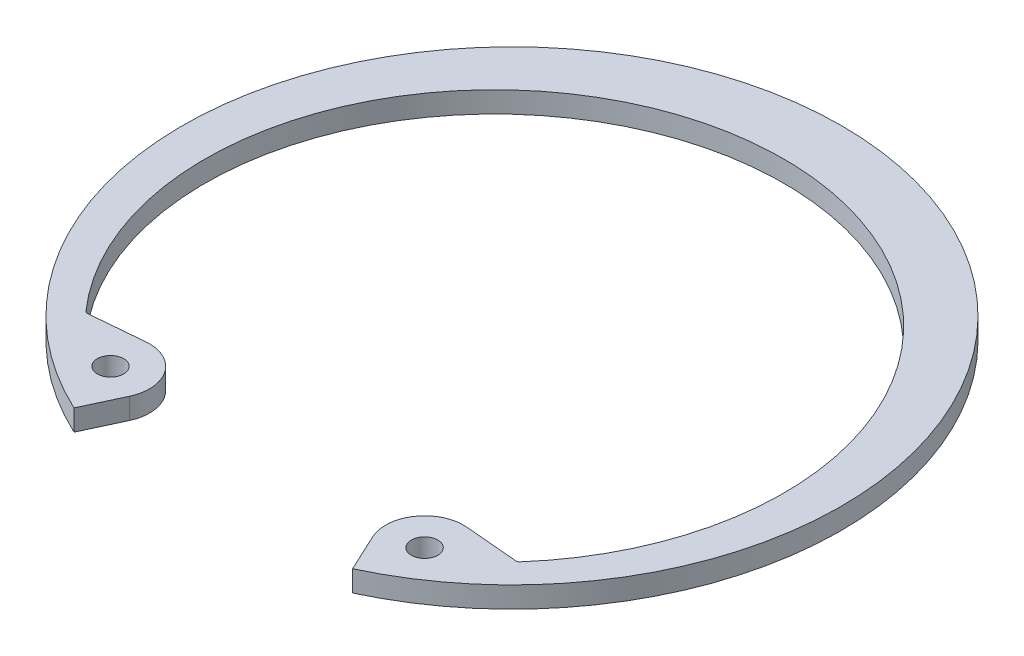
ISO-10303-21;
HEADER;
FILE_DESCRIPTION(('STEP AP214'),'2;1');
FILE_NAME('part.step','',(''),(''),'','','');
FILE_SCHEMA(('AUTOMOTIVE_DESIGN { 1 0 10303 214 1 1 1 1 }'));
ENDSEC;
DATA;
#1=APPLICATION_CONTEXT('core data for automotive mechanical design processes');
#2=APPLICATION_PROTOCOL_DEFINITION('international standard','automotive_design',2000,#1);
#3=PRODUCT_CONTEXT('',#1,'mechanical');
#4=PRODUCT('Part','Part','',(#3));
#5=PRODUCT_RELATED_PRODUCT_CATEGORY('part','',(#4));
#6=PRODUCT_DEFINITION_FORMATION('','',#4);
#7=PRODUCT_DEFINITION_CONTEXT('part definition',#1,'design');
#8=PRODUCT_DEFINITION('design','',#6,#7);
#9=PRODUCT_DEFINITION_SHAPE('','',#8);
#10=(LENGTH_UNIT() NAMED_UNIT(*) SI_UNIT(.MILLI.,.METRE.));
#11=(NAMED_UNIT(*) PLANE_ANGLE_UNIT() SI_UNIT($,.RADIAN.));
#12=(NAMED_UNIT(*) SI_UNIT($,.STERADIAN.) SOLID_ANGLE_UNIT());
#13=UNCERTAINTY_MEASURE_WITH_UNIT(LENGTH_MEASURE(1.E-05),#10,'distance_accuracy_value','');
#14=(GEOMETRIC_REPRESENTATION_CONTEXT(3) GLOBAL_UNCERTAINTY_ASSIGNED_CONTEXT((#13)) GLOBAL_UNIT_ASSIGNED_CONTEXT((#10,
#11,#12)) REPRESENTATION_CONTEXT('',''));
#15=CARTESIAN_POINT('',(0.,0.,0.));
#16=DIRECTION('',(0.,0.,1.));
#17=DIRECTION('',(1.,0.,0.));
#18=AXIS2_PLACEMENT_3D('',#15,#16,#17);
#19=CARTESIAN_POINT('',(11.7527599725772,-1.5748,18.2922002718915));
#20=DIRECTION('',(0.,1.,0.));
#21=DIRECTION('',(0.,0.,1.));
#22=AXIS2_PLACEMENT_3D('',#19,#20,#21);
#23=CYLINDRICAL_SURFACE('',#22,2.921);
#24=CARTESIAN_POINT('',(11.7527599725772,0.,18.2922002718915));
#25=DIRECTION('',(0.,1.,0.));
#26=DIRECTION('',(0.,0.,-1.));
#27=AXIS2_PLACEMENT_3D('',#24,#25,#26);
#28=CIRCLE('',#27,2.921);
#29=CARTESIAN_POINT('',(12.0073418971432,0.,15.3823155587655));
#30=VERTEX_POINT('',#29);
#31=CARTESIAN_POINT('',(9.10543492664317,0.,19.526668214436));
#32=VERTEX_POINT('',#31);
#33=EDGE_CURVE('E156',#30,#32,#28,.T.);
#34=ORIENTED_EDGE('',*,*,#33,.F.);
#35=DIRECTION('',(0.,1.,0.));
#36=VECTOR('',#35,1.);
#37=CARTESIAN_POINT('',(12.0073418971432,-1.5748,15.3823155587655));
#38=LINE('',#37,#36);
#39=CARTESIAN_POINT('',(12.0073418971432,-1.5748,15.3823155587655));
#40=VERTEX_POINT('',#39);
#41=EDGE_CURVE('E133',#40,#30,#38,.T.);
#42=ORIENTED_EDGE('',*,*,#41,.F.);
#43=CARTESIAN_POINT('',(11.7527599725772,-1.5748,18.2922002718915));
#44=DIRECTION('',(0.,1.,0.));
#45=DIRECTION('',(0.,0.,-1.));
#46=AXIS2_PLACEMENT_3D('',#43,#44,#45);
#47=CIRCLE('',#46,2.921);
#48=CARTESIAN_POINT('',(9.10543492664317,-1.5748,19.526668214436));
#49=VERTEX_POINT('',#48);
#50=EDGE_CURVE('E126',#40,#49,#47,.T.);
#51=ORIENTED_EDGE('',*,*,#50,.T.);
#52=DIRECTION('',(0.,1.,0.));
#53=VECTOR('',#52,1.);
#54=CARTESIAN_POINT('',(9.10543492664317,-1.5748,19.526668214436));
#55=LINE('',#54,#53);
#56=EDGE_CURVE('E109',#49,#32,#55,.T.);
#57=ORIENTED_EDGE('',*,*,#56,.T.);
#58=EDGE_LOOP('',(#34,#42,#51,#57));
#59=FACE_BOUND('',#58,.T.);
#60=ADVANCED_FACE('F34',(#59),#23,.T.);
#61=CARTESIAN_POINT('',(16.1504951389862,-1.5748,15.7447944986775));
#62=DIRECTION('',(0.0871557427476618,0.,-0.996194698091745));
#63=DIRECTION('',(-0.996194698091745,0.,-0.0871557427476618));
#64=AXIS2_PLACEMENT_3D('',#61,#62,#63);
#65=PLANE('',#64);
#66=DIRECTION('',(-0.996194698091745,0.,-0.0871557427476618));
#67=VECTOR('',#66,1.);
#68=CARTESIAN_POINT('',(16.1504951389862,0.,15.7447944986775));
#69=LINE('',#68,#67);
#70=CARTESIAN_POINT('',(16.0232690721609,0.,15.7336636601252));
#71=VERTEX_POINT('',#70);
#72=EDGE_CURVE('E134',#71,#30,#69,.T.);
#73=ORIENTED_EDGE('',*,*,#72,.F.);
#74=DIRECTION('',(0.,-1.,0.));
#75=VECTOR('',#74,1.);
#76=CARTESIAN_POINT('',(16.0232690721609,-1.5748,15.7336636601252));
#77=LINE('',#76,#75);
#78=CARTESIAN_POINT('',(16.0232690721609,-1.5748,15.7336636601252));
#79=VERTEX_POINT('',#78);
#80=EDGE_CURVE('E49',#71,#79,#77,.T.);
#81=ORIENTED_EDGE('',*,*,#80,.T.);
#82=DIRECTION('',(-0.996194698091745,0.,-0.0871557427476618));
#83=VECTOR('',#82,1.);
#84=CARTESIAN_POINT('',(16.1504951389862,-1.5748,15.7447944986775));
#85=LINE('',#84,#83);
#86=EDGE_CURVE('E120',#79,#40,#85,.T.);
#87=ORIENTED_EDGE('',*,*,#86,.T.);
#88=ORIENTED_EDGE('',*,*,#41,.T.);
#89=EDGE_LOOP('',(#73,#81,#87,#88));
#90=FACE_BOUND('',#89,.T.);
#91=ADVANCED_FACE('F211',(#90),#65,.T.);
#92=CARTESIAN_POINT('',(0.,-1.5748,1.3134003182426));
#93=DIRECTION('',(0.,1.,0.));
#94=DIRECTION('',(0.,0.,1.));
#95=AXIS2_PLACEMENT_3D('',#92,#93,#94);
#96=CYLINDRICAL_SURFACE('',#95,21.6588003182426);
#97=CARTESIAN_POINT('',(0.,0.,1.3134003182426));
#98=DIRECTION('',(0.,-1.,0.));
#99=DIRECTION('',(0.,0.,1.));
#100=AXIS2_PLACEMENT_3D('',#97,#98,#99);
#101=CIRCLE('',#100,21.6588003182426);
#102=CARTESIAN_POINT('',(-16.2358094013952,0.,15.6487455986003));
#103=VERTEX_POINT('',#102);
#104=CARTESIAN_POINT('',(16.2358094013952,0.,15.6487455986003));
#105=VERTEX_POINT('',#104);
#106=EDGE_CURVE('E136',#103,#105,#101,.T.);
#107=ORIENTED_EDGE('',*,*,#106,.F.);
#108=DIRECTION('',(0.,1.,0.));
#109=VECTOR('',#108,1.);
#110=CARTESIAN_POINT('',(-16.2358094013952,-1.5748,15.6487455986003));
#111=LINE('',#110,#109);
#112=CARTESIAN_POINT('',(-16.2358094013952,-1.5748,15.6487455986003));
#113=VERTEX_POINT('',#112);
#114=EDGE_CURVE('E187',#103,#113,#111,.F.);
#115=ORIENTED_EDGE('',*,*,#114,.T.);
#116=CARTESIAN_POINT('',(0.,-1.5748,1.3134003182426));
#117=DIRECTION('',(0.,-1.,0.));
#118=DIRECTION('',(0.,0.,1.));
#119=AXIS2_PLACEMENT_3D('',#116,#117,#118);
#120=CIRCLE('',#119,21.6588003182426);
#121=CARTESIAN_POINT('',(16.2358094013952,-1.5748,15.6487455986003));
#122=VERTEX_POINT('',#121);
#123=EDGE_CURVE('E152',#113,#122,#120,.T.);
#124=ORIENTED_EDGE('',*,*,#123,.T.);
#125=DIRECTION('',(0.,1.,0.));
#126=VECTOR('',#125,1.);
#127=CARTESIAN_POINT('',(16.2358094013952,-1.5748,15.6487455986003));
#128=LINE('',#127,#126);
#129=EDGE_CURVE('E184',#122,#105,#128,.T.);
#130=ORIENTED_EDGE('',*,*,#129,.T.);
#131=EDGE_LOOP('',(#107,#115,#124,#130));
#132=FACE_BOUND('',#131,.T.);
#133=ADVANCED_FACE('F207',(#132),#96,.F.);
#134=CARTESIAN_POINT('',(-16.1504951389862,-1.5748,15.7447944986774));
#135=DIRECTION('',(-0.087155742747656,0.,-0.996194698091746));
#136=DIRECTION('',(-0.996194698091746,0.,0.087155742747656));
#137=AXIS2_PLACEMENT_3D('',#134,#135,#136);
#138=PLANE('',#137);
#139=DIRECTION('',(-0.996194698091746,0.,0.087155742747656));
#140=VECTOR('',#139,1.);
#141=CARTESIAN_POINT('',(-16.1504951389862,-1.5748,15.7447944986774));
#142=LINE('',#141,#140);
#143=CARTESIAN_POINT('',(-12.0073418971431,-1.5748,15.3823155587655));
#144=VERTEX_POINT('',#143);
#145=CARTESIAN_POINT('',(-16.0232690721609,-1.5748,15.7336636601252));
#146=VERTEX_POINT('',#145);
#147=EDGE_CURVE('E149',#144,#146,#142,.T.);
#148=ORIENTED_EDGE('',*,*,#147,.T.);
#149=DIRECTION('',(0.,-1.,0.));
#150=VECTOR('',#149,1.);
#151=CARTESIAN_POINT('',(-16.0232690721609,0.,15.7336636601252));
#152=LINE('',#151,#150);
#153=CARTESIAN_POINT('',(-16.0232690721609,0.,15.7336636601252));
#154=VERTEX_POINT('',#153);
#155=EDGE_CURVE('E174',#146,#154,#152,.F.);
#156=ORIENTED_EDGE('',*,*,#155,.T.);
#157=DIRECTION('',(-0.996194698091746,0.,0.087155742747656));
#158=VECTOR('',#157,1.);
#159=CARTESIAN_POINT('',(-16.1504951389862,0.,15.7447944986774));
#160=LINE('',#159,#158);
#161=CARTESIAN_POINT('',(-12.0073418971431,0.,15.3823155587655));
#162=VERTEX_POINT('',#161);
#163=EDGE_CURVE('E169',#162,#154,#160,.T.);
#164=ORIENTED_EDGE('',*,*,#163,.F.);
#165=DIRECTION('',(0.,1.,0.));
#166=VECTOR('',#165,1.);
#167=CARTESIAN_POINT('',(-12.0073418971431,-1.5748,15.3823155587655));
#168=LINE('',#167,#166);
#169=EDGE_CURVE('E175',#144,#162,#168,.T.);
#170=ORIENTED_EDGE('',*,*,#169,.F.);
#171=EDGE_LOOP('',(#148,#156,#164,#170));
#172=FACE_BOUND('',#171,.T.);
#173=ADVANCED_FACE('F201',(#172),#138,.T.);
#174=CARTESIAN_POINT('',(-11.7527599725772,-1.5748,18.2922002718915));
#175=DIRECTION('',(0.,1.,0.));
#176=DIRECTION('',(0.,0.,1.));
#177=AXIS2_PLACEMENT_3D('',#174,#175,#176);
#178=CYLINDRICAL_SURFACE('',#177,2.921);
#179=CARTESIAN_POINT('',(-11.7527599725772,0.,18.2922002718915));
#180=DIRECTION('',(0.,1.,0.));
#181=DIRECTION('',(0.,0.,1.));
#182=AXIS2_PLACEMENT_3D('',#179,#180,#181);
#183=CIRCLE('',#182,2.921);
#184=CARTESIAN_POINT('',(-9.10543492664317,0.,19.526668214436));
#185=VERTEX_POINT('',#184);
#186=EDGE_CURVE('E166',#185,#162,#183,.T.);
#187=ORIENTED_EDGE('',*,*,#186,.F.);
#188=DIRECTION('',(0.,1.,0.));
#189=VECTOR('',#188,1.);
#190=CARTESIAN_POINT('',(-9.10543492664317,-1.5748,19.526668214436));
#191=LINE('',#190,#189);
#192=CARTESIAN_POINT('',(-9.10543492664317,-1.5748,19.526668214436));
#193=VERTEX_POINT('',#192);
#194=EDGE_CURVE('E177',#193,#185,#191,.T.);
#195=ORIENTED_EDGE('',*,*,#194,.F.);
#196=CARTESIAN_POINT('',(-11.7527599725772,-1.5748,18.2922002718915));
#197=DIRECTION('',(0.,1.,0.));
#198=DIRECTION('',(0.,0.,1.));
#199=AXIS2_PLACEMENT_3D('',#196,#197,#198);
#200=CIRCLE('',#199,2.921);
#201=EDGE_CURVE('E146',#193,#144,#200,.T.);
#202=ORIENTED_EDGE('',*,*,#201,.T.);
#203=ORIENTED_EDGE('',*,*,#169,.T.);
#204=EDGE_LOOP('',(#187,#195,#202,#203));
#205=FACE_BOUND('',#204,.T.);
#206=ADVANCED_FACE('F220',(#205),#178,.T.);
#207=CARTESIAN_POINT('',(-10.4232032366154,-1.5748,22.3526314747998));
#208=DIRECTION('',(0.906307787036653,0.,0.422618261740694));
#209=DIRECTION('',(0.422618261740694,0.,-0.906307787036653));
#210=AXIS2_PLACEMENT_3D('',#207,#208,#209);
#211=PLANE('',#210);
#212=DIRECTION('',(0.422618261740694,0.,-0.906307787036653));
#213=VECTOR('',#212,1.);
#214=CARTESIAN_POINT('',(-10.4232032366154,0.,22.3526314747998));
#215=LINE('',#214,#213);
#216=CARTESIAN_POINT('',(-10.4232032366154,0.,22.3526314747998));
#217=VERTEX_POINT('',#216);
#218=EDGE_CURVE('E163',#217,#185,#215,.T.);
#219=ORIENTED_EDGE('',*,*,#218,.F.);
#220=DIRECTION('',(0.,1.,0.));
#221=VECTOR('',#220,1.);
#222=CARTESIAN_POINT('',(-10.4232032366154,-1.5748,22.3526314747998));
#223=LINE('',#222,#221);
#224=CARTESIAN_POINT('',(-10.4232032366154,-1.5748,22.3526314747998));
#225=VERTEX_POINT('',#224);
#226=EDGE_CURVE('E179',#225,#217,#223,.T.);
#227=ORIENTED_EDGE('',*,*,#226,.F.);
#228=DIRECTION('',(0.422618261740694,0.,-0.906307787036653));
#229=VECTOR('',#228,1.);
#230=CARTESIAN_POINT('',(-10.4232032366154,-1.5748,22.3526314747998));
#231=LINE('',#230,#229);
#232=EDGE_CURVE('E143',#225,#193,#231,.T.);
#233=ORIENTED_EDGE('',*,*,#232,.T.);
#234=ORIENTED_EDGE('',*,*,#194,.T.);
#235=EDGE_LOOP('',(#219,#227,#233,#234));
#236=FACE_BOUND('',#235,.T.);
#237=ADVANCED_FACE('F217',(#236),#211,.T.);
#238=CARTESIAN_POINT('',(0.,-1.5748,0.));
#239=DIRECTION('',(0.,1.,0.));
#240=DIRECTION('',(0.,0.,1.));
#241=AXIS2_PLACEMENT_3D('',#238,#239,#240);
#242=CYLINDRICAL_SURFACE('',#241,24.6634);
#243=CARTESIAN_POINT('',(0.,0.,0.));
#244=DIRECTION('',(0.,1.,0.));
#245=DIRECTION('',(0.,0.,1.));
#246=AXIS2_PLACEMENT_3D('',#243,#244,#245);
#247=CIRCLE('',#246,24.6634);
#248=CARTESIAN_POINT('',(10.4232032366154,0.,22.3526314747998));
#249=VERTEX_POINT('',#248);
#250=EDGE_CURVE('E160',#249,#217,#247,.T.);
#251=ORIENTED_EDGE('',*,*,#250,.F.);
#252=DIRECTION('',(0.,1.,0.));
#253=VECTOR('',#252,1.);
#254=CARTESIAN_POINT('',(10.4232032366154,-1.5748,22.3526314747998));
#255=LINE('',#254,#253);
#256=CARTESIAN_POINT('',(10.4232032366154,-1.5748,22.3526314747998));
#257=VERTEX_POINT('',#256);
#258=EDGE_CURVE('E119',#257,#249,#255,.T.);
#259=ORIENTED_EDGE('',*,*,#258,.F.);
#260=CARTESIAN_POINT('',(0.,-1.5748,0.));
#261=DIRECTION('',(0.,1.,0.));
#262=DIRECTION('',(0.,0.,1.));
#263=AXIS2_PLACEMENT_3D('',#260,#261,#262);
#264=CIRCLE('',#263,24.6634);
#265=EDGE_CURVE('E129',#257,#225,#264,.T.);
#266=ORIENTED_EDGE('',*,*,#265,.T.);
#267=ORIENTED_EDGE('',*,*,#226,.T.);
#268=EDGE_LOOP('',(#251,#259,#266,#267));
#269=FACE_BOUND('',#268,.T.);
#270=ADVANCED_FACE('F215',(#269),#242,.T.);
#271=CARTESIAN_POINT('',(10.4232032366154,-1.5748,22.3526314747998));
#272=DIRECTION('',(-0.906307787036653,0.,0.422618261740694));
#273=DIRECTION('',(0.422618261740694,0.,0.906307787036653));
#274=AXIS2_PLACEMENT_3D('',#271,#272,#273);
#275=PLANE('',#274);
#276=DIRECTION('',(0.422618261740694,0.,0.906307787036653));
#277=VECTOR('',#276,1.);
#278=CARTESIAN_POINT('',(10.4232032366154,0.,22.3526314747998));
#279=LINE('',#278,#277);
#280=EDGE_CURVE('E114',#32,#249,#279,.T.);
#281=ORIENTED_EDGE('',*,*,#280,.F.);
#282=ORIENTED_EDGE('',*,*,#56,.F.);
#283=DIRECTION('',(0.422618261740694,0.,0.906307787036653));
#284=VECTOR('',#283,1.);
#285=CARTESIAN_POINT('',(10.4232032366154,-1.5748,22.3526314747998));
#286=LINE('',#285,#284);
#287=EDGE_CURVE('E112',#49,#257,#286,.T.);
#288=ORIENTED_EDGE('',*,*,#287,.T.);
#289=ORIENTED_EDGE('',*,*,#258,.T.);
#290=EDGE_LOOP('',(#281,#282,#288,#289));
#291=FACE_BOUND('',#290,.T.);
#292=ADVANCED_FACE('F111',(#291),#275,.T.);
#293=CARTESIAN_POINT('',(11.7527599725772,-1.5748,18.2922002718915));
#294=DIRECTION('',(0.,-1.,0.));
#295=DIRECTION('',(0.,0.,-1.));
#296=AXIS2_PLACEMENT_3D('',#293,#294,#295);
#297=PLANE('',#296);
#298=CARTESIAN_POINT('',(-11.7527599725772,-1.5748,18.2922002718915));
#299=DIRECTION('',(0.,1.,0.));
#300=DIRECTION('',(0.,0.,1.));
#301=AXIS2_PLACEMENT_3D('',#298,#299,#300);
#302=CIRCLE('',#301,0.990599999999999);
#303=CARTESIAN_POINT('',(-11.7527599725772,-1.5748,19.2828002718915));
#304=VERTEX_POINT('',#303);
#305=EDGE_CURVE('E361',#304,#304,#302,.T.);
#306=ORIENTED_EDGE('',*,*,#305,.T.);
#307=EDGE_LOOP('',(#306));
#308=FACE_BOUND('',#307,.T.);
#309=CARTESIAN_POINT('',(11.7527599725772,-1.5748,18.2922002718915));
#310=DIRECTION('',(0.,1.,0.));
#311=DIRECTION('',(0.,0.,1.));
#312=AXIS2_PLACEMENT_3D('',#309,#310,#311);
#313=CIRCLE('',#312,0.990599999999999);
#314=CARTESIAN_POINT('',(11.7527599725772,-1.5748,19.2828002718915));
#315=VERTEX_POINT('',#314);
#316=EDGE_CURVE('E158',#315,#315,#313,.T.);
#317=ORIENTED_EDGE('',*,*,#316,.T.);
#318=EDGE_LOOP('',(#317));
#319=FACE_BOUND('',#318,.T.);
#320=ORIENTED_EDGE('',*,*,#50,.F.);
#321=ORIENTED_EDGE('',*,*,#86,.F.);
#322=CARTESIAN_POINT('',(16.0454066308188,-1.5748,15.4806302068099));
#323=DIRECTION('',(0.,-1.,0.));
#324=DIRECTION('',(0.,0.,-1.));
#325=AXIS2_PLACEMENT_3D('',#322,#323,#324);
#326=CIRCLE('',#325,0.254);
#327=EDGE_CURVE('E11',#79,#122,#326,.F.);
#328=ORIENTED_EDGE('',*,*,#327,.T.);
#329=ORIENTED_EDGE('',*,*,#123,.F.);
#330=CARTESIAN_POINT('',(-16.0454066308188,-1.5748,15.4806302068099));
#331=DIRECTION('',(0.,-1.,0.));
#332=DIRECTION('',(0.,0.,-1.));
#333=AXIS2_PLACEMENT_3D('',#330,#331,#332);
#334=CIRCLE('',#333,0.254);
#335=EDGE_CURVE('E192',#113,#146,#334,.F.);
#336=ORIENTED_EDGE('',*,*,#335,.T.);
#337=ORIENTED_EDGE('',*,*,#147,.F.);
#338=ORIENTED_EDGE('',*,*,#201,.F.);
#339=ORIENTED_EDGE('',*,*,#232,.F.);
#340=ORIENTED_EDGE('',*,*,#265,.F.);
#341=ORIENTED_EDGE('',*,*,#287,.F.);
#342=EDGE_LOOP('',(#320,#321,#328,#329,#336,#337,#338,#339,#340,#341));
#343=FACE_BOUND('',#342,.T.);
#344=ADVANCED_FACE('F125',(#308,#319,#343),#297,.T.);
#345=CARTESIAN_POINT('',(11.7527599725772,0.,18.2922002718915));
#346=DIRECTION('',(0.,-1.,0.));
#347=DIRECTION('',(0.,0.,-1.));
#348=AXIS2_PLACEMENT_3D('',#345,#346,#347);
#349=PLANE('',#348);
#350=CARTESIAN_POINT('',(-11.7527599725772,0.,18.2922002718915));
#351=DIRECTION('',(0.,1.,0.));
#352=DIRECTION('',(0.,0.,1.));
#353=AXIS2_PLACEMENT_3D('',#350,#351,#352);
#354=CIRCLE('',#353,0.990599999999999);
#355=CARTESIAN_POINT('',(-11.7527599725772,0.,19.2828002718915));
#356=VERTEX_POINT('',#355);
#357=EDGE_CURVE('E357',#356,#356,#354,.T.);
#358=ORIENTED_EDGE('',*,*,#357,.F.);
#359=EDGE_LOOP('',(#358));
#360=FACE_BOUND('',#359,.T.);
#361=CARTESIAN_POINT('',(11.7527599725772,0.,18.2922002718915));
#362=DIRECTION('',(0.,1.,0.));
#363=DIRECTION('',(0.,0.,1.));
#364=AXIS2_PLACEMENT_3D('',#361,#362,#363);
#365=CIRCLE('',#364,0.990599999999999);
#366=CARTESIAN_POINT('',(11.7527599725772,0.,19.2828002718915));
#367=VERTEX_POINT('',#366);
#368=EDGE_CURVE('E139',#367,#367,#365,.T.);
#369=ORIENTED_EDGE('',*,*,#368,.F.);
#370=EDGE_LOOP('',(#369));
#371=FACE_BOUND('',#370,.T.);
#372=ORIENTED_EDGE('',*,*,#33,.T.);
#373=ORIENTED_EDGE('',*,*,#280,.T.);
#374=ORIENTED_EDGE('',*,*,#250,.T.);
#375=ORIENTED_EDGE('',*,*,#218,.T.);
#376=ORIENTED_EDGE('',*,*,#186,.T.);
#377=ORIENTED_EDGE('',*,*,#163,.T.);
#378=CARTESIAN_POINT('',(-16.0454066308188,0.,15.4806302068099));
#379=DIRECTION('',(0.,-1.,0.));
#380=DIRECTION('',(0.,0.,-1.));
#381=AXIS2_PLACEMENT_3D('',#378,#379,#380);
#382=CIRCLE('',#381,0.254);
#383=EDGE_CURVE('E190',#154,#103,#382,.T.);
#384=ORIENTED_EDGE('',*,*,#383,.T.);
#385=ORIENTED_EDGE('',*,*,#106,.T.);
#386=CARTESIAN_POINT('',(16.0454066308188,0.,15.4806302068099));
#387=DIRECTION('',(0.,-1.,0.));
#388=DIRECTION('',(0.,0.,-1.));
#389=AXIS2_PLACEMENT_3D('',#386,#387,#388);
#390=CIRCLE('',#389,0.254);
#391=EDGE_CURVE('E42',#105,#71,#390,.T.);
#392=ORIENTED_EDGE('',*,*,#391,.T.);
#393=ORIENTED_EDGE('',*,*,#72,.T.);
#394=EDGE_LOOP('',(#372,#373,#374,#375,#376,#377,#384,#385,#392,#393));
#395=FACE_BOUND('',#394,.T.);
#396=ADVANCED_FACE('F205',(#360,#371,#395),#349,.F.);
#397=CARTESIAN_POINT('',(11.7527599725772,-1.5748,18.2922002718915));
#398=DIRECTION('',(0.,1.,0.));
#399=DIRECTION('',(0.,0.,1.));
#400=AXIS2_PLACEMENT_3D('',#397,#398,#399);
#401=CYLINDRICAL_SURFACE('',#400,0.990599999999999);
#402=ORIENTED_EDGE('',*,*,#316,.F.);
#403=EDGE_LOOP('',(#402));
#404=FACE_BOUND('',#403,.T.);
#405=ORIENTED_EDGE('',*,*,#368,.T.);
#406=EDGE_LOOP('',(#405));
#407=FACE_BOUND('',#406,.T.);
#408=ADVANCED_FACE('F243',(#404,#407),#401,.F.);
#409=CARTESIAN_POINT('',(-11.7527599725772,-1.5748,18.2922002718915));
#410=DIRECTION('',(0.,1.,0.));
#411=DIRECTION('',(0.,0.,1.));
#412=AXIS2_PLACEMENT_3D('',#409,#410,#411);
#413=CYLINDRICAL_SURFACE('',#412,0.990599999999999);
#414=ORIENTED_EDGE('',*,*,#305,.F.);
#415=EDGE_LOOP('',(#414));
#416=FACE_BOUND('',#415,.T.);
#417=ORIENTED_EDGE('',*,*,#357,.T.);
#418=EDGE_LOOP('',(#417));
#419=FACE_BOUND('',#418,.T.);
#420=ADVANCED_FACE('F238',(#416,#419),#413,.F.);
#421=CARTESIAN_POINT('',(-16.0454066308188,-1.5748,15.4806302068099));
#422=DIRECTION('',(0.,1.,0.));
#423=DIRECTION('',(0.,0.,1.));
#424=AXIS2_PLACEMENT_3D('',#421,#422,#423);
#425=CYLINDRICAL_SURFACE('',#424,0.254);
#426=ORIENTED_EDGE('',*,*,#335,.F.);
#427=ORIENTED_EDGE('',*,*,#114,.F.);
#428=ORIENTED_EDGE('',*,*,#383,.F.);
#429=ORIENTED_EDGE('',*,*,#155,.F.);
#430=EDGE_LOOP('',(#426,#427,#428,#429));
#431=FACE_BOUND('',#430,.T.);
#432=ADVANCED_FACE('F203',(#431),#425,.F.);
#433=CARTESIAN_POINT('',(16.0454066308188,-1.5748,15.4806302068099));
#434=DIRECTION('',(0.,1.,0.));
#435=DIRECTION('',(0.,0.,1.));
#436=AXIS2_PLACEMENT_3D('',#433,#434,#435);
#437=CYLINDRICAL_SURFACE('',#436,0.254);
#438=ORIENTED_EDGE('',*,*,#327,.F.);
#439=ORIENTED_EDGE('',*,*,#80,.F.);
#440=ORIENTED_EDGE('',*,*,#391,.F.);
#441=ORIENTED_EDGE('',*,*,#129,.F.);
#442=EDGE_LOOP('',(#438,#439,#440,#441));
#443=FACE_BOUND('',#442,.T.);
#444=ADVANCED_FACE('F36',(#443),#437,.F.);
#445=CLOSED_SHELL('',(#60,#91,#133,#173,#206,#237,#270,#292,#344,#396,#408,#420,#432,#444));
#446=MANIFOLD_SOLID_BREP('B2',#445);
#447=ADVANCED_BREP_SHAPE_REPRESENTATION('',(#18,#446),#14);
#448=SHAPE_DEFINITION_REPRESENTATION(#9,#447);
ENDSEC;
END-ISO-10303-21;
